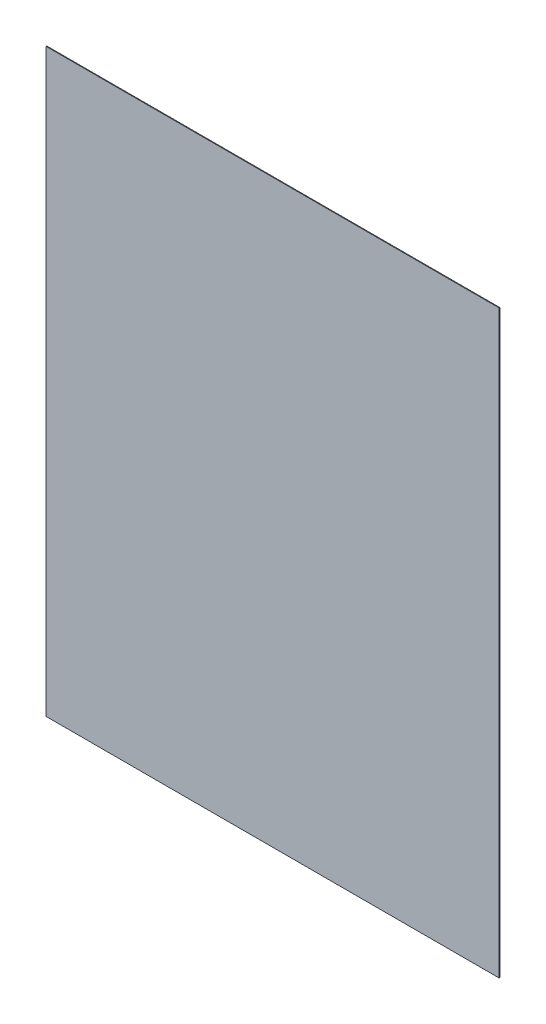
ISO-10303-21;
HEADER;
FILE_DESCRIPTION(('STEP AP214'),'2;1');
FILE_NAME('part.step','',(''),(''),'','','');
FILE_SCHEMA(('AUTOMOTIVE_DESIGN { 1 0 10303 214 1 1 1 1 }'));
ENDSEC;
DATA;
#1=APPLICATION_CONTEXT('core data for automotive mechanical design processes');
#2=APPLICATION_PROTOCOL_DEFINITION('international standard','automotive_design',2000,#1);
#3=PRODUCT_CONTEXT('',#1,'mechanical');
#4=PRODUCT('Part','Part','',(#3));
#5=PRODUCT_RELATED_PRODUCT_CATEGORY('part','',(#4));
#6=PRODUCT_DEFINITION_FORMATION('','',#4);
#7=PRODUCT_DEFINITION_CONTEXT('part definition',#1,'design');
#8=PRODUCT_DEFINITION('design','',#6,#7);
#9=PRODUCT_DEFINITION_SHAPE('','',#8);
#10=(LENGTH_UNIT() NAMED_UNIT(*) SI_UNIT(.MILLI.,.METRE.));
#11=(NAMED_UNIT(*) PLANE_ANGLE_UNIT() SI_UNIT($,.RADIAN.));
#12=(NAMED_UNIT(*) SI_UNIT($,.STERADIAN.) SOLID_ANGLE_UNIT());
#13=UNCERTAINTY_MEASURE_WITH_UNIT(LENGTH_MEASURE(1.E-05),#10,'distance_accuracy_value','');
#14=(GEOMETRIC_REPRESENTATION_CONTEXT(3) GLOBAL_UNCERTAINTY_ASSIGNED_CONTEXT((#13)) GLOBAL_UNIT_ASSIGNED_CONTEXT((#10,
#11,#12)) REPRESENTATION_CONTEXT('',''));
#15=CARTESIAN_POINT('',(0.,0.,0.));
#16=DIRECTION('',(0.,0.,1.));
#17=DIRECTION('',(1.,0.,0.));
#18=AXIS2_PLACEMENT_3D('',#15,#16,#17);
#19=CARTESIAN_POINT('',(323.895,-415.,1.));
#20=DIRECTION('',(-1.,0.,0.));
#21=DIRECTION('',(0.,0.,1.));
#22=AXIS2_PLACEMENT_3D('',#19,#20,#21);
#23=PLANE('',#22);
#24=DIRECTION('',(0.,1.,0.));
#25=VECTOR('',#24,1.);
#26=CARTESIAN_POINT('',(323.895,-415.,0.));
#27=LINE('',#26,#25);
#28=CARTESIAN_POINT('',(323.895,-415.,0.));
#29=VERTEX_POINT('',#28);
#30=CARTESIAN_POINT('',(323.895,415.,0.));
#31=VERTEX_POINT('',#30);
#32=EDGE_CURVE('E101',#29,#31,#27,.T.);
#33=ORIENTED_EDGE('',*,*,#32,.T.);
#34=DIRECTION('',(0.,0.,-1.));
#35=VECTOR('',#34,1.);
#36=CARTESIAN_POINT('',(323.895,415.,1.));
#37=LINE('',#36,#35);
#38=CARTESIAN_POINT('',(323.895,415.,1.));
#39=VERTEX_POINT('',#38);
#40=EDGE_CURVE('E11',#39,#31,#37,.T.);
#41=ORIENTED_EDGE('',*,*,#40,.F.);
#42=DIRECTION('',(0.,1.,0.));
#43=VECTOR('',#42,1.);
#44=CARTESIAN_POINT('',(323.895,-415.,1.));
#45=LINE('',#44,#43);
#46=CARTESIAN_POINT('',(323.895,-415.,1.));
#47=VERTEX_POINT('',#46);
#48=EDGE_CURVE('E89',#47,#39,#45,.T.);
#49=ORIENTED_EDGE('',*,*,#48,.F.);
#50=DIRECTION('',(0.,0.,-1.));
#51=VECTOR('',#50,1.);
#52=CARTESIAN_POINT('',(323.895,-415.,1.));
#53=LINE('',#52,#51);
#54=EDGE_CURVE('E97',#47,#29,#53,.T.);
#55=ORIENTED_EDGE('',*,*,#54,.T.);
#56=EDGE_LOOP('',(#33,#41,#49,#55));
#57=FACE_BOUND('',#56,.T.);
#58=ADVANCED_FACE('F38',(#57),#23,.F.);
#59=CARTESIAN_POINT('',(-323.895,415.,1.));
#60=DIRECTION('',(0.,-1.,0.));
#61=DIRECTION('',(0.,0.,-1.));
#62=AXIS2_PLACEMENT_3D('',#59,#60,#61);
#63=PLANE('',#62);
#64=DIRECTION('',(-1.,0.,0.));
#65=VECTOR('',#64,1.);
#66=CARTESIAN_POINT('',(-323.895,415.,0.));
#67=LINE('',#66,#65);
#68=CARTESIAN_POINT('',(-323.895,415.,0.));
#69=VERTEX_POINT('',#68);
#70=EDGE_CURVE('E93',#31,#69,#67,.T.);
#71=ORIENTED_EDGE('',*,*,#70,.T.);
#72=DIRECTION('',(0.,0.,-1.));
#73=VECTOR('',#72,1.);
#74=CARTESIAN_POINT('',(-323.895,415.,1.));
#75=LINE('',#74,#73);
#76=CARTESIAN_POINT('',(-323.895,415.,1.));
#77=VERTEX_POINT('',#76);
#78=EDGE_CURVE('E46',#77,#69,#75,.T.);
#79=ORIENTED_EDGE('',*,*,#78,.F.);
#80=DIRECTION('',(-1.,0.,0.));
#81=VECTOR('',#80,1.);
#82=CARTESIAN_POINT('',(-323.895,415.,1.));
#83=LINE('',#82,#81);
#84=EDGE_CURVE('E84',#39,#77,#83,.T.);
#85=ORIENTED_EDGE('',*,*,#84,.F.);
#86=ORIENTED_EDGE('',*,*,#40,.T.);
#87=EDGE_LOOP('',(#71,#79,#85,#86));
#88=FACE_BOUND('',#87,.T.);
#89=ADVANCED_FACE('F92',(#88),#63,.F.);
#90=CARTESIAN_POINT('',(-323.895,-415.,1.));
#91=DIRECTION('',(1.,0.,0.));
#92=DIRECTION('',(0.,0.,-1.));
#93=AXIS2_PLACEMENT_3D('',#90,#91,#92);
#94=PLANE('',#93);
#95=DIRECTION('',(0.,-1.,0.));
#96=VECTOR('',#95,1.);
#97=CARTESIAN_POINT('',(-323.895,-415.,0.));
#98=LINE('',#97,#96);
#99=CARTESIAN_POINT('',(-323.895,-415.,0.));
#100=VERTEX_POINT('',#99);
#101=EDGE_CURVE('E71',#69,#100,#98,.T.);
#102=ORIENTED_EDGE('',*,*,#101,.T.);
#103=DIRECTION('',(0.,0.,-1.));
#104=VECTOR('',#103,1.);
#105=CARTESIAN_POINT('',(-323.895,-415.,1.));
#106=LINE('',#105,#104);
#107=CARTESIAN_POINT('',(-323.895,-415.,1.));
#108=VERTEX_POINT('',#107);
#109=EDGE_CURVE('E94',#108,#100,#106,.T.);
#110=ORIENTED_EDGE('',*,*,#109,.F.);
#111=DIRECTION('',(0.,-1.,0.));
#112=VECTOR('',#111,1.);
#113=CARTESIAN_POINT('',(-323.895,-415.,1.));
#114=LINE('',#113,#112);
#115=EDGE_CURVE('E87',#77,#108,#114,.T.);
#116=ORIENTED_EDGE('',*,*,#115,.F.);
#117=ORIENTED_EDGE('',*,*,#78,.T.);
#118=EDGE_LOOP('',(#102,#110,#116,#117));
#119=FACE_BOUND('',#118,.T.);
#120=ADVANCED_FACE('F95',(#119),#94,.F.);
#121=CARTESIAN_POINT('',(-323.895,-415.,1.));
#122=DIRECTION('',(0.,1.,0.));
#123=DIRECTION('',(0.,0.,1.));
#124=AXIS2_PLACEMENT_3D('',#121,#122,#123);
#125=PLANE('',#124);
#126=DIRECTION('',(1.,0.,0.));
#127=VECTOR('',#126,1.);
#128=CARTESIAN_POINT('',(-323.895,-415.,0.));
#129=LINE('',#128,#127);
#130=EDGE_CURVE('E77',#100,#29,#129,.T.);
#131=ORIENTED_EDGE('',*,*,#130,.T.);
#132=ORIENTED_EDGE('',*,*,#54,.F.);
#133=DIRECTION('',(1.,0.,0.));
#134=VECTOR('',#133,1.);
#135=CARTESIAN_POINT('',(-323.895,-415.,1.));
#136=LINE('',#135,#134);
#137=EDGE_CURVE('E54',#108,#47,#136,.T.);
#138=ORIENTED_EDGE('',*,*,#137,.F.);
#139=ORIENTED_EDGE('',*,*,#109,.T.);
#140=EDGE_LOOP('',(#131,#132,#138,#139));
#141=FACE_BOUND('',#140,.T.);
#142=ADVANCED_FACE('F108',(#141),#125,.F.);
#143=CARTESIAN_POINT('',(0.,0.,1.));
#144=DIRECTION('',(0.,0.,-1.));
#145=DIRECTION('',(-1.,0.,0.));
#146=AXIS2_PLACEMENT_3D('',#143,#144,#145);
#147=PLANE('',#146);
#148=ORIENTED_EDGE('',*,*,#48,.T.);
#149=ORIENTED_EDGE('',*,*,#84,.T.);
#150=ORIENTED_EDGE('',*,*,#115,.T.);
#151=ORIENTED_EDGE('',*,*,#137,.T.);
#152=EDGE_LOOP('',(#148,#149,#150,#151));
#153=FACE_BOUND('',#152,.T.);
#154=ADVANCED_FACE('F85',(#153),#147,.F.);
#155=CARTESIAN_POINT('',(0.,0.,0.));
#156=DIRECTION('',(0.,0.,-1.));
#157=DIRECTION('',(-1.,0.,0.));
#158=AXIS2_PLACEMENT_3D('',#155,#156,#157);
#159=PLANE('',#158);
#160=ORIENTED_EDGE('',*,*,#32,.F.);
#161=ORIENTED_EDGE('',*,*,#130,.F.);
#162=ORIENTED_EDGE('',*,*,#101,.F.);
#163=ORIENTED_EDGE('',*,*,#70,.F.);
#164=EDGE_LOOP('',(#160,#161,#162,#163));
#165=FACE_BOUND('',#164,.T.);
#166=ADVANCED_FACE('F111',(#165),#159,.T.);
#167=CLOSED_SHELL('',(#58,#89,#120,#142,#154,#166));
#168=MANIFOLD_SOLID_BREP('B2',#167);
#169=ADVANCED_BREP_SHAPE_REPRESENTATION('',(#18,#168),#14);
#170=SHAPE_DEFINITION_REPRESENTATION(#9,#169);
ENDSEC;
END-ISO-10303-21;
